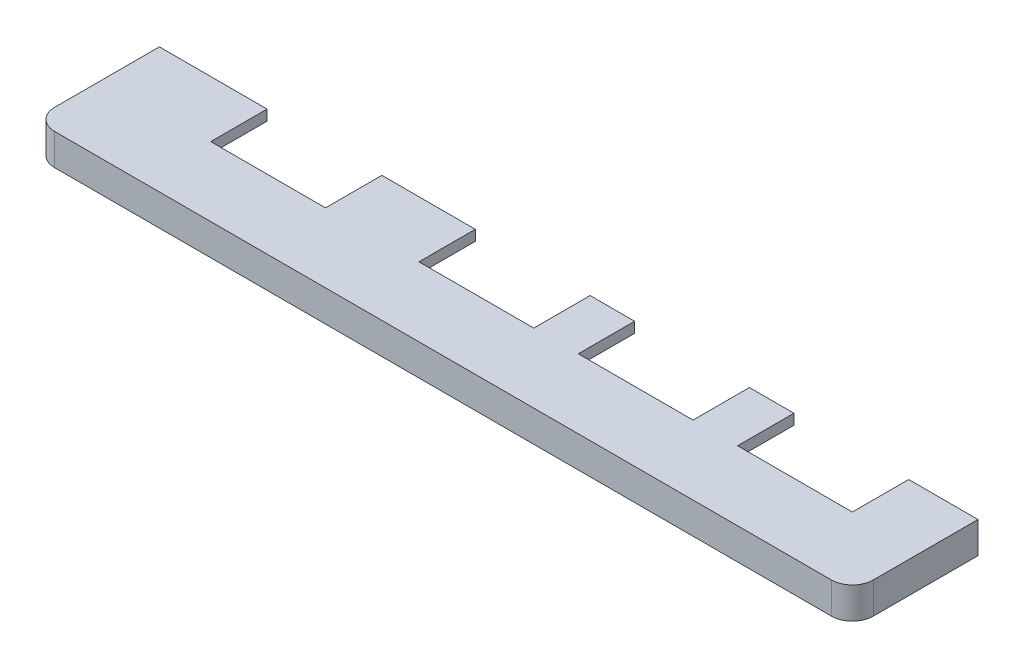
ISO-10303-21;
HEADER;
FILE_DESCRIPTION(('STEP AP214'),'2;1');
FILE_NAME('part.step','',(''),(''),'','','');
FILE_SCHEMA(('AUTOMOTIVE_DESIGN { 1 0 10303 214 1 1 1 1 }'));
ENDSEC;
DATA;
#1=APPLICATION_CONTEXT('core data for automotive mechanical design processes');
#2=APPLICATION_PROTOCOL_DEFINITION('international standard','automotive_design',2000,#1);
#3=PRODUCT_CONTEXT('',#1,'mechanical');
#4=PRODUCT('Part','Part','',(#3));
#5=PRODUCT_RELATED_PRODUCT_CATEGORY('part','',(#4));
#6=PRODUCT_DEFINITION_FORMATION('','',#4);
#7=PRODUCT_DEFINITION_CONTEXT('part definition',#1,'design');
#8=PRODUCT_DEFINITION('design','',#6,#7);
#9=PRODUCT_DEFINITION_SHAPE('','',#8);
#10=(LENGTH_UNIT() NAMED_UNIT(*) SI_UNIT(.MILLI.,.METRE.));
#11=(NAMED_UNIT(*) PLANE_ANGLE_UNIT() SI_UNIT($,.RADIAN.));
#12=(NAMED_UNIT(*) SI_UNIT($,.STERADIAN.) SOLID_ANGLE_UNIT());
#13=UNCERTAINTY_MEASURE_WITH_UNIT(LENGTH_MEASURE(1.E-05),#10,'distance_accuracy_value','');
#14=(GEOMETRIC_REPRESENTATION_CONTEXT(3) GLOBAL_UNCERTAINTY_ASSIGNED_CONTEXT((#13)) GLOBAL_UNIT_ASSIGNED_CONTEXT((#10,
#11,#12)) REPRESENTATION_CONTEXT('',''));
#15=CARTESIAN_POINT('',(0.,0.,0.));
#16=DIRECTION('',(0.,0.,1.));
#17=DIRECTION('',(1.,0.,0.));
#18=AXIS2_PLACEMENT_3D('',#15,#16,#17);
#19=CARTESIAN_POINT('',(0.,1.27,29.6799));
#20=DIRECTION('',(0.,0.,-1.));
#21=DIRECTION('',(-1.,0.,0.));
#22=AXIS2_PLACEMENT_3D('',#19,#20,#21);
#23=PLANE('',#22);
#24=DIRECTION('',(1.,0.,0.));
#25=VECTOR('',#24,1.);
#26=CARTESIAN_POINT('',(0.,0.,29.6799));
#27=LINE('',#26,#25);
#28=CARTESIAN_POINT('',(-36.6395,0.,29.6799));
#29=VERTEX_POINT('',#28);
#30=CARTESIAN_POINT('',(-22.6949,0.,29.6799));
#31=VERTEX_POINT('',#30);
#32=EDGE_CURVE('E343',#29,#31,#27,.T.);
#33=ORIENTED_EDGE('',*,*,#32,.F.);
#34=DIRECTION('',(0.,-1.,0.));
#35=VECTOR('',#34,1.);
#36=CARTESIAN_POINT('',(-36.6395,1.27,29.6799));
#37=LINE('',#36,#35);
#38=CARTESIAN_POINT('',(-36.6395,1.27,29.6799));
#39=VERTEX_POINT('',#38);
#40=EDGE_CURVE('E373',#39,#29,#37,.T.);
#41=ORIENTED_EDGE('',*,*,#40,.F.);
#42=DIRECTION('',(1.,0.,0.));
#43=VECTOR('',#42,1.);
#44=CARTESIAN_POINT('',(0.,1.27,29.6799));
#45=LINE('',#44,#43);
#46=CARTESIAN_POINT('',(-22.6949,1.27,29.6799));
#47=VERTEX_POINT('',#46);
#48=EDGE_CURVE('E398',#39,#47,#45,.T.);
#49=ORIENTED_EDGE('',*,*,#48,.T.);
#50=DIRECTION('',(0.,-1.,0.));
#51=VECTOR('',#50,1.);
#52=CARTESIAN_POINT('',(-22.6949,1.27,29.6799));
#53=LINE('',#52,#51);
#54=EDGE_CURVE('E401',#47,#31,#53,.T.);
#55=ORIENTED_EDGE('',*,*,#54,.T.);
#56=EDGE_LOOP('',(#33,#41,#49,#55));
#57=FACE_BOUND('',#56,.T.);
#58=ADVANCED_FACE('F34',(#57),#23,.T.);
#59=CARTESIAN_POINT('',(0.,1.27,29.6799));
#60=DIRECTION('',(0.,0.,-1.));
#61=DIRECTION('',(-1.,0.,0.));
#62=AXIS2_PLACEMENT_3D('',#59,#60,#61);
#63=PLANE('',#62);
#64=DIRECTION('',(1.,0.,0.));
#65=VECTOR('',#64,1.);
#66=CARTESIAN_POINT('',(0.,0.,29.6799));
#67=LINE('',#66,#65);
#68=CARTESIAN_POINT('',(-11.3411,0.,29.6799));
#69=VERTEX_POINT('',#68);
#70=CARTESIAN_POINT('',(2.60350000000002,0.,29.6799));
#71=VERTEX_POINT('',#70);
#72=EDGE_CURVE('E347',#69,#71,#67,.T.);
#73=ORIENTED_EDGE('',*,*,#72,.F.);
#74=DIRECTION('',(0.,-1.,0.));
#75=VECTOR('',#74,1.);
#76=CARTESIAN_POINT('',(-11.3411,1.27,29.6799));
#77=LINE('',#76,#75);
#78=CARTESIAN_POINT('',(-11.3411,1.27,29.6799));
#79=VERTEX_POINT('',#78);
#80=EDGE_CURVE('E383',#79,#69,#77,.T.);
#81=ORIENTED_EDGE('',*,*,#80,.F.);
#82=DIRECTION('',(1.,0.,0.));
#83=VECTOR('',#82,1.);
#84=CARTESIAN_POINT('',(0.,1.27,29.6799));
#85=LINE('',#84,#83);
#86=CARTESIAN_POINT('',(2.60350000000002,1.27,29.6799));
#87=VERTEX_POINT('',#86);
#88=EDGE_CURVE('E384',#79,#87,#85,.T.);
#89=ORIENTED_EDGE('',*,*,#88,.T.);
#90=DIRECTION('',(0.,-1.,0.));
#91=VECTOR('',#90,1.);
#92=CARTESIAN_POINT('',(2.60350000000002,1.27,29.6799));
#93=LINE('',#92,#91);
#94=EDGE_CURVE('E387',#87,#71,#93,.T.);
#95=ORIENTED_EDGE('',*,*,#94,.T.);
#96=EDGE_LOOP('',(#73,#81,#89,#95));
#97=FACE_BOUND('',#96,.T.);
#98=ADVANCED_FACE('F477',(#97),#63,.T.);
#99=CARTESIAN_POINT('',(0.,1.27,29.6799));
#100=DIRECTION('',(0.,0.,-1.));
#101=DIRECTION('',(-1.,0.,0.));
#102=AXIS2_PLACEMENT_3D('',#99,#100,#101);
#103=PLANE('',#102);
#104=DIRECTION('',(1.,0.,0.));
#105=VECTOR('',#104,1.);
#106=CARTESIAN_POINT('',(0.,0.,29.6799));
#107=LINE('',#106,#105);
#108=CARTESIAN_POINT('',(8.01370000000001,0.,29.6799));
#109=VERTEX_POINT('',#108);
#110=CARTESIAN_POINT('',(21.9583,0.,29.6799));
#111=VERTEX_POINT('',#110);
#112=EDGE_CURVE('E459',#109,#111,#107,.T.);
#113=ORIENTED_EDGE('',*,*,#112,.F.);
#114=DIRECTION('',(0.,-1.,0.));
#115=VECTOR('',#114,1.);
#116=CARTESIAN_POINT('',(8.01370000000001,1.27,29.6799));
#117=LINE('',#116,#115);
#118=CARTESIAN_POINT('',(8.01370000000001,1.27,29.6799));
#119=VERTEX_POINT('',#118);
#120=EDGE_CURVE('E372',#119,#109,#117,.T.);
#121=ORIENTED_EDGE('',*,*,#120,.F.);
#122=DIRECTION('',(1.,0.,0.));
#123=VECTOR('',#122,1.);
#124=CARTESIAN_POINT('',(0.,1.27,29.6799));
#125=LINE('',#124,#123);
#126=CARTESIAN_POINT('',(21.9583,1.27,29.6799));
#127=VERTEX_POINT('',#126);
#128=EDGE_CURVE('E374',#119,#127,#125,.T.);
#129=ORIENTED_EDGE('',*,*,#128,.T.);
#130=DIRECTION('',(0.,-1.,0.));
#131=VECTOR('',#130,1.);
#132=CARTESIAN_POINT('',(21.9583,1.27,29.6799));
#133=LINE('',#132,#131);
#134=EDGE_CURVE('E377',#127,#111,#133,.T.);
#135=ORIENTED_EDGE('',*,*,#134,.T.);
#136=EDGE_LOOP('',(#113,#121,#129,#135));
#137=FACE_BOUND('',#136,.T.);
#138=ADVANCED_FACE('F595',(#137),#103,.T.);
#139=CARTESIAN_POINT('',(0.,1.27,29.6799));
#140=DIRECTION('',(0.,0.,-1.));
#141=DIRECTION('',(-1.,0.,0.));
#142=AXIS2_PLACEMENT_3D('',#139,#140,#141);
#143=PLANE('',#142);
#144=DIRECTION('',(1.,0.,0.));
#145=VECTOR('',#144,1.);
#146=CARTESIAN_POINT('',(0.,0.,29.6799));
#147=LINE('',#146,#145);
#148=CARTESIAN_POINT('',(27.3685000000001,0.,29.6799));
#149=VERTEX_POINT('',#148);
#150=CARTESIAN_POINT('',(41.3131000000001,0.,29.6799));
#151=VERTEX_POINT('',#150);
#152=EDGE_CURVE('E308',#149,#151,#147,.T.);
#153=ORIENTED_EDGE('',*,*,#152,.F.);
#154=DIRECTION('',(0.,-1.,0.));
#155=VECTOR('',#154,1.);
#156=CARTESIAN_POINT('',(27.3685000000001,1.27,29.6799));
#157=LINE('',#156,#155);
#158=CARTESIAN_POINT('',(27.3685000000001,1.27,29.6799));
#159=VERTEX_POINT('',#158);
#160=EDGE_CURVE('E362',#159,#149,#157,.T.);
#161=ORIENTED_EDGE('',*,*,#160,.F.);
#162=DIRECTION('',(1.,0.,0.));
#163=VECTOR('',#162,1.);
#164=CARTESIAN_POINT('',(0.,1.27,29.6799));
#165=LINE('',#164,#163);
#166=CARTESIAN_POINT('',(41.3131000000001,1.27,29.6799));
#167=VERTEX_POINT('',#166);
#168=EDGE_CURVE('E364',#159,#167,#165,.T.);
#169=ORIENTED_EDGE('',*,*,#168,.T.);
#170=DIRECTION('',(0.,-1.,0.));
#171=VECTOR('',#170,1.);
#172=CARTESIAN_POINT('',(41.3131000000001,1.27,29.6799));
#173=LINE('',#172,#171);
#174=EDGE_CURVE('E367',#167,#151,#173,.T.);
#175=ORIENTED_EDGE('',*,*,#174,.T.);
#176=EDGE_LOOP('',(#153,#161,#169,#175));
#177=FACE_BOUND('',#176,.T.);
#178=ADVANCED_FACE('F582',(#177),#143,.T.);
#179=CARTESIAN_POINT('',(0.,-2.54,36.83));
#180=DIRECTION('',(0.,0.,1.));
#181=DIRECTION('',(1.,0.,0.));
#182=AXIS2_PLACEMENT_3D('',#179,#180,#181);
#183=PLANE('',#182);
#184=DIRECTION('',(1.,0.,0.));
#185=VECTOR('',#184,1.);
#186=CARTESIAN_POINT('',(0.,0.,36.83));
#187=LINE('',#186,#185);
#188=CARTESIAN_POINT('',(-48.4632,0.,36.83));
#189=VERTEX_POINT('',#188);
#190=CARTESIAN_POINT('',(48.4632,0.,36.83));
#191=VERTEX_POINT('',#190);
#192=EDGE_CURVE('E287',#189,#191,#187,.T.);
#193=ORIENTED_EDGE('',*,*,#192,.T.);
#194=DIRECTION('',(0.,1.,0.));
#195=VECTOR('',#194,1.);
#196=CARTESIAN_POINT('',(48.4632,-2.54,36.83));
#197=LINE('',#196,#195);
#198=CARTESIAN_POINT('',(48.4632,-2.54,36.83));
#199=VERTEX_POINT('',#198);
#200=EDGE_CURVE('E301',#199,#191,#197,.T.);
#201=ORIENTED_EDGE('',*,*,#200,.F.);
#202=DIRECTION('',(1.,0.,0.));
#203=VECTOR('',#202,1.);
#204=CARTESIAN_POINT('',(0.,-2.54,36.83));
#205=LINE('',#204,#203);
#206=CARTESIAN_POINT('',(-48.4632,-2.54,36.83));
#207=VERTEX_POINT('',#206);
#208=EDGE_CURVE('E296',#207,#199,#205,.T.);
#209=ORIENTED_EDGE('',*,*,#208,.F.);
#210=DIRECTION('',(0.,1.,0.));
#211=VECTOR('',#210,1.);
#212=CARTESIAN_POINT('',(-48.4632,-2.54,36.83));
#213=LINE('',#212,#211);
#214=EDGE_CURVE('E282',#207,#189,#213,.T.);
#215=ORIENTED_EDGE('',*,*,#214,.T.);
#216=EDGE_LOOP('',(#193,#201,#209,#215));
#217=FACE_BOUND('',#216,.T.);
#218=ADVANCED_FACE('F626',(#217),#183,.F.);
#219=CARTESIAN_POINT('',(-47.1932,1.27,35.56));
#220=DIRECTION('',(0.,1.,0.));
#221=DIRECTION('',(0.,0.,1.));
#222=AXIS2_PLACEMENT_3D('',#219,#220,#221);
#223=CYLINDRICAL_SURFACE('',#222,2.54);
#224=CARTESIAN_POINT('',(-47.1932,1.27,35.56));
#225=DIRECTION('',(0.,1.,0.));
#226=DIRECTION('',(0.,0.,1.));
#227=AXIS2_PLACEMENT_3D('',#224,#225,#226);
#228=CIRCLE('',#227,2.54);
#229=CARTESIAN_POINT('',(-49.7332,1.27,35.56));
#230=VERTEX_POINT('',#229);
#231=CARTESIAN_POINT('',(-47.1932,1.27,38.1));
#232=VERTEX_POINT('',#231);
#233=EDGE_CURVE('E395',#230,#232,#228,.T.);
#234=ORIENTED_EDGE('',*,*,#233,.F.);
#235=DIRECTION('',(0.,-1.,0.));
#236=VECTOR('',#235,1.);
#237=CARTESIAN_POINT('',(-49.7332,1.27,35.56));
#238=LINE('',#237,#236);
#239=CARTESIAN_POINT('',(-49.7332,-2.54,35.56));
#240=VERTEX_POINT('',#239);
#241=EDGE_CURVE('E427',#240,#230,#238,.F.);
#242=ORIENTED_EDGE('',*,*,#241,.F.);
#243=CARTESIAN_POINT('',(-47.1932,-2.54,35.56));
#244=DIRECTION('',(0.,-1.,0.));
#245=DIRECTION('',(0.,0.,-1.));
#246=AXIS2_PLACEMENT_3D('',#243,#244,#245);
#247=CIRCLE('',#246,2.54);
#248=CARTESIAN_POINT('',(-47.1932,-2.54,38.1));
#249=VERTEX_POINT('',#248);
#250=EDGE_CURVE('E297',#249,#240,#247,.T.);
#251=ORIENTED_EDGE('',*,*,#250,.F.);
#252=DIRECTION('',(0.,-1.,0.));
#253=VECTOR('',#252,1.);
#254=CARTESIAN_POINT('',(-47.1932,0.,38.1));
#255=LINE('',#254,#253);
#256=EDGE_CURVE('E442',#232,#249,#255,.T.);
#257=ORIENTED_EDGE('',*,*,#256,.F.);
#258=EDGE_LOOP('',(#234,#242,#251,#257));
#259=FACE_BOUND('',#258,.T.);
#260=ADVANCED_FACE('F566',(#259),#223,.T.);
#261=CARTESIAN_POINT('',(0.,1.27,38.1));
#262=DIRECTION('',(0.,0.,-1.));
#263=DIRECTION('',(-1.,0.,0.));
#264=AXIS2_PLACEMENT_3D('',#261,#262,#263);
#265=PLANE('',#264);
#266=ORIENTED_EDGE('',*,*,#256,.T.);
#267=DIRECTION('',(-1.,0.,0.));
#268=VECTOR('',#267,1.);
#269=CARTESIAN_POINT('',(0.,-2.54,38.1));
#270=LINE('',#269,#268);
#271=CARTESIAN_POINT('',(47.1932000000001,-2.54,38.1));
#272=VERTEX_POINT('',#271);
#273=EDGE_CURVE('E284',#272,#249,#270,.T.);
#274=ORIENTED_EDGE('',*,*,#273,.F.);
#275=DIRECTION('',(0.,-1.,0.));
#276=VECTOR('',#275,1.);
#277=CARTESIAN_POINT('',(47.1932000000001,1.27,38.1));
#278=LINE('',#277,#276);
#279=CARTESIAN_POINT('',(47.1932000000001,1.27,38.1));
#280=VERTEX_POINT('',#279);
#281=EDGE_CURVE('E440',#272,#280,#278,.F.);
#282=ORIENTED_EDGE('',*,*,#281,.T.);
#283=DIRECTION('',(1.,0.,0.));
#284=VECTOR('',#283,1.);
#285=CARTESIAN_POINT('',(0.,1.27,38.1));
#286=LINE('',#285,#284);
#287=EDGE_CURVE('E391',#232,#280,#286,.T.);
#288=ORIENTED_EDGE('',*,*,#287,.F.);
#289=EDGE_LOOP('',(#266,#274,#282,#288));
#290=FACE_BOUND('',#289,.T.);
#291=ADVANCED_FACE('F570',(#290),#265,.F.);
#292=CARTESIAN_POINT('',(47.1932000000001,1.27,35.56));
#293=DIRECTION('',(0.,-1.,0.));
#294=DIRECTION('',(0.,0.,-1.));
#295=AXIS2_PLACEMENT_3D('',#292,#293,#294);
#296=CYLINDRICAL_SURFACE('',#295,2.54);
#297=CARTESIAN_POINT('',(47.1932000000001,1.27,35.56));
#298=DIRECTION('',(0.,1.,0.));
#299=DIRECTION('',(0.,0.,1.));
#300=AXIS2_PLACEMENT_3D('',#297,#298,#299);
#301=CIRCLE('',#300,2.54);
#302=CARTESIAN_POINT('',(49.7332000000001,1.27,35.56));
#303=VERTEX_POINT('',#302);
#304=EDGE_CURVE('E394',#280,#303,#301,.T.);
#305=ORIENTED_EDGE('',*,*,#304,.F.);
#306=ORIENTED_EDGE('',*,*,#281,.F.);
#307=CARTESIAN_POINT('',(47.1932000000001,-2.54,35.56));
#308=DIRECTION('',(0.,-1.,0.));
#309=DIRECTION('',(0.,0.,-1.));
#310=AXIS2_PLACEMENT_3D('',#307,#308,#309);
#311=CIRCLE('',#310,2.54);
#312=CARTESIAN_POINT('',(49.7332000000001,-2.54,35.56));
#313=VERTEX_POINT('',#312);
#314=EDGE_CURVE('E281',#313,#272,#311,.T.);
#315=ORIENTED_EDGE('',*,*,#314,.F.);
#316=DIRECTION('',(0.,-1.,0.));
#317=VECTOR('',#316,1.);
#318=CARTESIAN_POINT('',(49.7332000000001,1.27,35.56));
#319=LINE('',#318,#317);
#320=EDGE_CURVE('E279',#303,#313,#319,.T.);
#321=ORIENTED_EDGE('',*,*,#320,.F.);
#322=EDGE_LOOP('',(#305,#306,#315,#321));
#323=FACE_BOUND('',#322,.T.);
#324=ADVANCED_FACE('F572',(#323),#296,.T.);
#325=CARTESIAN_POINT('',(0.,-2.54,32.385));
#326=DIRECTION('',(0.,0.,1.));
#327=DIRECTION('',(1.,0.,0.));
#328=AXIS2_PLACEMENT_3D('',#325,#326,#327);
#329=PLANE('',#328);
#330=DIRECTION('',(1.,0.,0.));
#331=VECTOR('',#330,1.);
#332=CARTESIAN_POINT('',(0.,0.,32.385));
#333=LINE('',#332,#331);
#334=CARTESIAN_POINT('',(-44.0182,0.,32.385));
#335=VERTEX_POINT('',#334);
#336=CARTESIAN_POINT('',(44.0182,0.,32.385));
#337=VERTEX_POINT('',#336);
#338=EDGE_CURVE('E327',#335,#337,#333,.T.);
#339=ORIENTED_EDGE('',*,*,#338,.T.);
#340=DIRECTION('',(0.,1.,0.));
#341=VECTOR('',#340,1.);
#342=CARTESIAN_POINT('',(44.0182,-2.54,32.385));
#343=LINE('',#342,#341);
#344=CARTESIAN_POINT('',(44.0182,-2.54,32.385));
#345=VERTEX_POINT('',#344);
#346=EDGE_CURVE('E317',#345,#337,#343,.T.);
#347=ORIENTED_EDGE('',*,*,#346,.F.);
#348=DIRECTION('',(1.,0.,0.));
#349=VECTOR('',#348,1.);
#350=CARTESIAN_POINT('',(0.,-2.54,32.385));
#351=LINE('',#350,#349);
#352=CARTESIAN_POINT('',(-44.0182,-2.54,32.385));
#353=VERTEX_POINT('',#352);
#354=EDGE_CURVE('E320',#353,#345,#351,.T.);
#355=ORIENTED_EDGE('',*,*,#354,.F.);
#356=DIRECTION('',(0.,1.,0.));
#357=VECTOR('',#356,1.);
#358=CARTESIAN_POINT('',(-44.0182,-2.54,32.385));
#359=LINE('',#358,#357);
#360=EDGE_CURVE('E339',#353,#335,#359,.T.);
#361=ORIENTED_EDGE('',*,*,#360,.T.);
#362=EDGE_LOOP('',(#339,#347,#355,#361));
#363=FACE_BOUND('',#362,.T.);
#364=ADVANCED_FACE('F636',(#363),#329,.F.);
#365=CARTESIAN_POINT('',(0.,-2.54,33.655));
#366=DIRECTION('',(0.,0.,1.));
#367=DIRECTION('',(1.,0.,0.));
#368=AXIS2_PLACEMENT_3D('',#365,#366,#367);
#369=PLANE('',#368);
#370=DIRECTION('',(1.,0.,0.));
#371=VECTOR('',#370,1.);
#372=CARTESIAN_POINT('',(0.,0.,33.655));
#373=LINE('',#372,#371);
#374=CARTESIAN_POINT('',(-45.2882,0.,33.655));
#375=VERTEX_POINT('',#374);
#376=CARTESIAN_POINT('',(45.2882,0.,33.655));
#377=VERTEX_POINT('',#376);
#378=EDGE_CURVE('E307',#375,#377,#373,.T.);
#379=ORIENTED_EDGE('',*,*,#378,.F.);
#380=DIRECTION('',(0.,1.,0.));
#381=VECTOR('',#380,1.);
#382=CARTESIAN_POINT('',(-45.2882,-2.54,33.655));
#383=LINE('',#382,#381);
#384=CARTESIAN_POINT('',(-45.2882,-2.54,33.655));
#385=VERTEX_POINT('',#384);
#386=EDGE_CURVE('E328',#385,#375,#383,.T.);
#387=ORIENTED_EDGE('',*,*,#386,.F.);
#388=DIRECTION('',(1.,0.,0.));
#389=VECTOR('',#388,1.);
#390=CARTESIAN_POINT('',(0.,-2.54,33.655));
#391=LINE('',#390,#389);
#392=CARTESIAN_POINT('',(45.2882,-2.54,33.655));
#393=VERTEX_POINT('',#392);
#394=EDGE_CURVE('E303',#385,#393,#391,.T.);
#395=ORIENTED_EDGE('',*,*,#394,.T.);
#396=DIRECTION('',(0.,1.,0.));
#397=VECTOR('',#396,1.);
#398=CARTESIAN_POINT('',(45.2882,-2.54,33.655));
#399=LINE('',#398,#397);
#400=EDGE_CURVE('E336',#393,#377,#399,.T.);
#401=ORIENTED_EDGE('',*,*,#400,.T.);
#402=EDGE_LOOP('',(#379,#387,#395,#401));
#403=FACE_BOUND('',#402,.T.);
#404=ADVANCED_FACE('F639',(#403),#369,.T.);
#405=CARTESIAN_POINT('',(0.,-2.54,0.));
#406=DIRECTION('',(0.,-1.,0.));
#407=DIRECTION('',(0.,0.,-1.));
#408=AXIS2_PLACEMENT_3D('',#405,#406,#407);
#409=PLANE('',#408);
#410=DIRECTION('',(-1.,0.,0.));
#411=VECTOR('',#410,1.);
#412=CARTESIAN_POINT('',(0.,-2.54,22.8346));
#413=LINE('',#412,#411);
#414=CARTESIAN_POINT('',(45.2882,-2.54,22.8346));
#415=VERTEX_POINT('',#414);
#416=CARTESIAN_POINT('',(44.0182,-2.54,22.8346));
#417=VERTEX_POINT('',#416);
#418=EDGE_CURVE('E11',#415,#417,#413,.T.);
#419=ORIENTED_EDGE('',*,*,#418,.F.);
#420=DIRECTION('',(0.,0.,-1.));
#421=VECTOR('',#420,1.);
#422=CARTESIAN_POINT('',(45.2882,-2.54,0.));
#423=LINE('',#422,#421);
#424=EDGE_CURVE('E313',#393,#415,#423,.T.);
#425=ORIENTED_EDGE('',*,*,#424,.F.);
#426=ORIENTED_EDGE('',*,*,#394,.F.);
#427=DIRECTION('',(0.,0.,-1.));
#428=VECTOR('',#427,1.);
#429=CARTESIAN_POINT('',(-45.2882,-2.54,0.));
#430=LINE('',#429,#428);
#431=CARTESIAN_POINT('',(-45.2882,-2.54,22.8346));
#432=VERTEX_POINT('',#431);
#433=EDGE_CURVE('E316',#385,#432,#430,.T.);
#434=ORIENTED_EDGE('',*,*,#433,.T.);
#435=CARTESIAN_POINT('',(-44.0182,-2.54,22.8346));
#436=VERTEX_POINT('',#435);
#437=EDGE_CURVE('E38',#436,#432,#413,.T.);
#438=ORIENTED_EDGE('',*,*,#437,.F.);
#439=DIRECTION('',(0.,0.,-1.));
#440=VECTOR('',#439,1.);
#441=CARTESIAN_POINT('',(-44.0182,-2.54,0.));
#442=LINE('',#441,#440);
#443=EDGE_CURVE('E324',#353,#436,#442,.T.);
#444=ORIENTED_EDGE('',*,*,#443,.F.);
#445=ORIENTED_EDGE('',*,*,#354,.T.);
#446=DIRECTION('',(0.,0.,-1.));
#447=VECTOR('',#446,1.);
#448=CARTESIAN_POINT('',(44.0182,-2.54,0.));
#449=LINE('',#448,#447);
#450=EDGE_CURVE('E321',#345,#417,#449,.T.);
#451=ORIENTED_EDGE('',*,*,#450,.T.);
#452=EDGE_LOOP('',(#419,#425,#426,#434,#438,#444,#445,#451));
#453=FACE_BOUND('',#452,.T.);
#454=ADVANCED_FACE('F643',(#453),#409,.T.);
#455=CARTESIAN_POINT('',(45.2882,-2.54,0.));
#456=DIRECTION('',(1.,0.,0.));
#457=DIRECTION('',(0.,0.,-1.));
#458=AXIS2_PLACEMENT_3D('',#455,#456,#457);
#459=PLANE('',#458);
#460=DIRECTION('',(0.,-1.,0.));
#461=VECTOR('',#460,1.);
#462=CARTESIAN_POINT('',(45.2882,-2.54,22.8346));
#463=LINE('',#462,#461);
#464=CARTESIAN_POINT('',(45.2882,0.,22.8346));
#465=VERTEX_POINT('',#464);
#466=EDGE_CURVE('E500',#465,#415,#463,.T.);
#467=ORIENTED_EDGE('',*,*,#466,.F.);
#468=DIRECTION('',(0.,0.,-1.));
#469=VECTOR('',#468,1.);
#470=CARTESIAN_POINT('',(45.2882,0.,0.));
#471=LINE('',#470,#469);
#472=EDGE_CURVE('E329',#377,#465,#471,.T.);
#473=ORIENTED_EDGE('',*,*,#472,.F.);
#474=ORIENTED_EDGE('',*,*,#400,.F.);
#475=ORIENTED_EDGE('',*,*,#424,.T.);
#476=EDGE_LOOP('',(#467,#473,#474,#475));
#477=FACE_BOUND('',#476,.T.);
#478=ADVANCED_FACE('F647',(#477),#459,.T.);
#479=CARTESIAN_POINT('',(44.0182,-2.54,0.));
#480=DIRECTION('',(1.,0.,0.));
#481=DIRECTION('',(0.,0.,-1.));
#482=AXIS2_PLACEMENT_3D('',#479,#480,#481);
#483=PLANE('',#482);
#484=DIRECTION('',(0.,0.,-1.));
#485=VECTOR('',#484,1.);
#486=CARTESIAN_POINT('',(44.0182,0.,0.));
#487=LINE('',#486,#485);
#488=CARTESIAN_POINT('',(44.0182,0.,22.8346));
#489=VERTEX_POINT('',#488);
#490=EDGE_CURVE('E337',#337,#489,#487,.T.);
#491=ORIENTED_EDGE('',*,*,#490,.T.);
#492=DIRECTION('',(0.,-1.,0.));
#493=VECTOR('',#492,1.);
#494=CARTESIAN_POINT('',(44.0182,-2.54,22.8346));
#495=LINE('',#494,#493);
#496=EDGE_CURVE('E509',#489,#417,#495,.T.);
#497=ORIENTED_EDGE('',*,*,#496,.T.);
#498=ORIENTED_EDGE('',*,*,#450,.F.);
#499=ORIENTED_EDGE('',*,*,#346,.T.);
#500=EDGE_LOOP('',(#491,#497,#498,#499));
#501=FACE_BOUND('',#500,.T.);
#502=ADVANCED_FACE('F651',(#501),#483,.F.);
#503=CARTESIAN_POINT('',(-44.0182,-2.54,0.));
#504=DIRECTION('',(1.,0.,0.));
#505=DIRECTION('',(0.,0.,-1.));
#506=AXIS2_PLACEMENT_3D('',#503,#504,#505);
#507=PLANE('',#506);
#508=DIRECTION('',(0.,-1.,0.));
#509=VECTOR('',#508,1.);
#510=CARTESIAN_POINT('',(-44.0182,-2.54,22.8346));
#511=LINE('',#510,#509);
#512=CARTESIAN_POINT('',(-44.0182,0.,22.8346));
#513=VERTEX_POINT('',#512);
#514=EDGE_CURVE('E520',#513,#436,#511,.T.);
#515=ORIENTED_EDGE('',*,*,#514,.F.);
#516=DIRECTION('',(0.,0.,-1.));
#517=VECTOR('',#516,1.);
#518=CARTESIAN_POINT('',(-44.0182,0.,0.));
#519=LINE('',#518,#517);
#520=EDGE_CURVE('E340',#335,#513,#519,.T.);
#521=ORIENTED_EDGE('',*,*,#520,.F.);
#522=ORIENTED_EDGE('',*,*,#360,.F.);
#523=ORIENTED_EDGE('',*,*,#443,.T.);
#524=EDGE_LOOP('',(#515,#521,#522,#523));
#525=FACE_BOUND('',#524,.T.);
#526=ADVANCED_FACE('F655',(#525),#507,.T.);
#527=CARTESIAN_POINT('',(-45.2882,-2.54,0.));
#528=DIRECTION('',(1.,0.,0.));
#529=DIRECTION('',(0.,0.,-1.));
#530=AXIS2_PLACEMENT_3D('',#527,#528,#529);
#531=PLANE('',#530);
#532=DIRECTION('',(0.,0.,-1.));
#533=VECTOR('',#532,1.);
#534=CARTESIAN_POINT('',(-45.2882,0.,0.));
#535=LINE('',#534,#533);
#536=CARTESIAN_POINT('',(-45.2882,0.,22.8346));
#537=VERTEX_POINT('',#536);
#538=EDGE_CURVE('E333',#375,#537,#535,.T.);
#539=ORIENTED_EDGE('',*,*,#538,.T.);
#540=DIRECTION('',(0.,-1.,0.));
#541=VECTOR('',#540,1.);
#542=CARTESIAN_POINT('',(-45.2882,-2.54,22.8346));
#543=LINE('',#542,#541);
#544=EDGE_CURVE('E525',#537,#432,#543,.T.);
#545=ORIENTED_EDGE('',*,*,#544,.T.);
#546=ORIENTED_EDGE('',*,*,#433,.F.);
#547=ORIENTED_EDGE('',*,*,#386,.T.);
#548=EDGE_LOOP('',(#539,#545,#546,#547));
#549=FACE_BOUND('',#548,.T.);
#550=ADVANCED_FACE('F659',(#549),#531,.F.);
#551=CARTESIAN_POINT('',(0.,1.27,0.));
#552=DIRECTION('',(0.,1.,0.));
#553=DIRECTION('',(0.,0.,1.));
#554=AXIS2_PLACEMENT_3D('',#551,#552,#553);
#555=PLANE('',#554);
#556=DIRECTION('',(1.,0.,0.));
#557=VECTOR('',#556,1.);
#558=CARTESIAN_POINT('',(-49.7332,1.27,22.8346));
#559=LINE('',#558,#557);
#560=CARTESIAN_POINT('',(-49.7332,1.27,22.8346));
#561=VERTEX_POINT('',#560);
#562=CARTESIAN_POINT('',(-36.6395,1.27,22.8346));
#563=VERTEX_POINT('',#562);
#564=EDGE_CURVE('E275',#561,#563,#559,.T.);
#565=ORIENTED_EDGE('',*,*,#564,.F.);
#566=DIRECTION('',(0.,0.,-1.));
#567=VECTOR('',#566,1.);
#568=CARTESIAN_POINT('',(-49.7332,1.27,0.));
#569=LINE('',#568,#567);
#570=EDGE_CURVE('E363',#230,#561,#569,.T.);
#571=ORIENTED_EDGE('',*,*,#570,.F.);
#572=ORIENTED_EDGE('',*,*,#233,.T.);
#573=ORIENTED_EDGE('',*,*,#287,.T.);
#574=ORIENTED_EDGE('',*,*,#304,.T.);
#575=DIRECTION('',(0.,0.,-1.));
#576=VECTOR('',#575,1.);
#577=CARTESIAN_POINT('',(49.7332000000001,1.27,0.));
#578=LINE('',#577,#576);
#579=CARTESIAN_POINT('',(49.7332000000001,1.27,22.8346));
#580=VERTEX_POINT('',#579);
#581=EDGE_CURVE('E291',#303,#580,#578,.T.);
#582=ORIENTED_EDGE('',*,*,#581,.T.);
#583=CARTESIAN_POINT('',(41.3131000000001,1.27,22.8346));
#584=VERTEX_POINT('',#583);
#585=EDGE_CURVE('E259',#584,#580,#559,.T.);
#586=ORIENTED_EDGE('',*,*,#585,.F.);
#587=DIRECTION('',(0.,0.,1.));
#588=VECTOR('',#587,1.);
#589=CARTESIAN_POINT('',(41.3131000000001,1.27,0.));
#590=LINE('',#589,#588);
#591=EDGE_CURVE('E312',#584,#167,#590,.T.);
#592=ORIENTED_EDGE('',*,*,#591,.T.);
#593=ORIENTED_EDGE('',*,*,#168,.F.);
#594=DIRECTION('',(0.,0.,1.));
#595=VECTOR('',#594,1.);
#596=CARTESIAN_POINT('',(27.3685,1.27,0.));
#597=LINE('',#596,#595);
#598=CARTESIAN_POINT('',(27.3685000000001,1.27,22.8346));
#599=VERTEX_POINT('',#598);
#600=EDGE_CURVE('E360',#599,#159,#597,.T.);
#601=ORIENTED_EDGE('',*,*,#600,.F.);
#602=CARTESIAN_POINT('',(21.9583,1.27,22.8346));
#603=VERTEX_POINT('',#602);
#604=EDGE_CURVE('E497',#603,#599,#559,.T.);
#605=ORIENTED_EDGE('',*,*,#604,.F.);
#606=DIRECTION('',(0.,0.,1.));
#607=VECTOR('',#606,1.);
#608=CARTESIAN_POINT('',(21.9583,1.27,0.));
#609=LINE('',#608,#607);
#610=EDGE_CURVE('E369',#603,#127,#609,.T.);
#611=ORIENTED_EDGE('',*,*,#610,.T.);
#612=ORIENTED_EDGE('',*,*,#128,.F.);
#613=DIRECTION('',(0.,0.,1.));
#614=VECTOR('',#613,1.);
#615=CARTESIAN_POINT('',(8.01370000000001,1.27,0.));
#616=LINE('',#615,#614);
#617=CARTESIAN_POINT('',(8.01370000000001,1.27,22.8346));
#618=VERTEX_POINT('',#617);
#619=EDGE_CURVE('E370',#618,#119,#616,.T.);
#620=ORIENTED_EDGE('',*,*,#619,.F.);
#621=CARTESIAN_POINT('',(2.60350000000002,1.27,22.8346));
#622=VERTEX_POINT('',#621);
#623=EDGE_CURVE('E493',#622,#618,#559,.T.);
#624=ORIENTED_EDGE('',*,*,#623,.F.);
#625=DIRECTION('',(0.,0.,1.));
#626=VECTOR('',#625,1.);
#627=CARTESIAN_POINT('',(2.60350000000002,1.27,0.));
#628=LINE('',#627,#626);
#629=EDGE_CURVE('E380',#622,#87,#628,.T.);
#630=ORIENTED_EDGE('',*,*,#629,.T.);
#631=ORIENTED_EDGE('',*,*,#88,.F.);
#632=DIRECTION('',(0.,0.,1.));
#633=VECTOR('',#632,1.);
#634=CARTESIAN_POINT('',(-11.3411,1.27,0.));
#635=LINE('',#634,#633);
#636=CARTESIAN_POINT('',(-11.3411,1.27,22.8346));
#637=VERTEX_POINT('',#636);
#638=EDGE_CURVE('E381',#637,#79,#635,.T.);
#639=ORIENTED_EDGE('',*,*,#638,.F.);
#640=CARTESIAN_POINT('',(-22.6949,1.27,22.8346));
#641=VERTEX_POINT('',#640);
#642=EDGE_CURVE('E496',#641,#637,#559,.T.);
#643=ORIENTED_EDGE('',*,*,#642,.F.);
#644=DIRECTION('',(0.,0.,-1.));
#645=VECTOR('',#644,1.);
#646=CARTESIAN_POINT('',(-22.6949,1.27,0.));
#647=LINE('',#646,#645);
#648=EDGE_CURVE('E402',#47,#641,#647,.T.);
#649=ORIENTED_EDGE('',*,*,#648,.F.);
#650=ORIENTED_EDGE('',*,*,#48,.F.);
#651=DIRECTION('',(0.,0.,-1.));
#652=VECTOR('',#651,1.);
#653=CARTESIAN_POINT('',(-36.6395,1.27,0.));
#654=LINE('',#653,#652);
#655=EDGE_CURVE('E390',#39,#563,#654,.T.);
#656=ORIENTED_EDGE('',*,*,#655,.T.);
#657=EDGE_LOOP('',(#565,#571,#572,#573,#574,#582,#586,#592,#593,#601,#605,#611,#612,#620,#624,
#630,#631,#639,#643,#649,#650,#656));
#658=FACE_BOUND('',#657,.T.);
#659=ADVANCED_FACE('F490',(#658),#555,.T.);
#660=CARTESIAN_POINT('',(27.3685,1.27,0.));
#661=DIRECTION('',(1.,0.,0.));
#662=DIRECTION('',(0.,0.,-1.));
#663=AXIS2_PLACEMENT_3D('',#660,#661,#662);
#664=PLANE('',#663);
#665=DIRECTION('',(0.,-1.,0.));
#666=VECTOR('',#665,1.);
#667=CARTESIAN_POINT('',(27.3685000000001,1.27,22.8346));
#668=LINE('',#667,#666);
#669=CARTESIAN_POINT('',(27.3685000000001,0.,22.8346));
#670=VERTEX_POINT('',#669);
#671=EDGE_CURVE('E530',#599,#670,#668,.T.);
#672=ORIENTED_EDGE('',*,*,#671,.F.);
#673=ORIENTED_EDGE('',*,*,#600,.T.);
#674=ORIENTED_EDGE('',*,*,#160,.T.);
#675=DIRECTION('',(0.,0.,1.));
#676=VECTOR('',#675,1.);
#677=CARTESIAN_POINT('',(27.3685,0.,0.));
#678=LINE('',#677,#676);
#679=EDGE_CURVE('E457',#670,#149,#678,.T.);
#680=ORIENTED_EDGE('',*,*,#679,.F.);
#681=EDGE_LOOP('',(#672,#673,#674,#680));
#682=FACE_BOUND('',#681,.T.);
#683=ADVANCED_FACE('F587',(#682),#664,.T.);
#684=CARTESIAN_POINT('',(0.,-2.54,0.));
#685=DIRECTION('',(0.,-1.,0.));
#686=DIRECTION('',(0.,0.,-1.));
#687=AXIS2_PLACEMENT_3D('',#684,#685,#686);
#688=PLANE('',#687);
#689=DIRECTION('',(1.,0.,0.));
#690=VECTOR('',#689,1.);
#691=CARTESIAN_POINT('',(-49.7332,-2.54,22.8346));
#692=LINE('',#691,#690);
#693=CARTESIAN_POINT('',(48.4632,-2.54,22.8346));
#694=VERTEX_POINT('',#693);
#695=CARTESIAN_POINT('',(49.7332000000001,-2.54,22.8346));
#696=VERTEX_POINT('',#695);
#697=EDGE_CURVE('E256',#694,#696,#692,.T.);
#698=ORIENTED_EDGE('',*,*,#697,.T.);
#699=DIRECTION('',(0.,0.,1.));
#700=VECTOR('',#699,1.);
#701=CARTESIAN_POINT('',(49.7332000000001,-2.54,0.));
#702=LINE('',#701,#700);
#703=EDGE_CURVE('E271',#696,#313,#702,.T.);
#704=ORIENTED_EDGE('',*,*,#703,.T.);
#705=ORIENTED_EDGE('',*,*,#314,.T.);
#706=ORIENTED_EDGE('',*,*,#273,.T.);
#707=ORIENTED_EDGE('',*,*,#250,.T.);
#708=DIRECTION('',(0.,0.,-1.));
#709=VECTOR('',#708,1.);
#710=CARTESIAN_POINT('',(-49.7332,-2.54,0.));
#711=LINE('',#710,#709);
#712=CARTESIAN_POINT('',(-49.7332,-2.54,22.8346));
#713=VERTEX_POINT('',#712);
#714=EDGE_CURVE('E293',#240,#713,#711,.T.);
#715=ORIENTED_EDGE('',*,*,#714,.T.);
#716=CARTESIAN_POINT('',(-48.4632,-2.54,22.8346));
#717=VERTEX_POINT('',#716);
#718=EDGE_CURVE('E265',#713,#717,#692,.T.);
#719=ORIENTED_EDGE('',*,*,#718,.T.);
#720=DIRECTION('',(0.,0.,-1.));
#721=VECTOR('',#720,1.);
#722=CARTESIAN_POINT('',(-48.4632,-2.54,0.));
#723=LINE('',#722,#721);
#724=EDGE_CURVE('E298',#207,#717,#723,.T.);
#725=ORIENTED_EDGE('',*,*,#724,.F.);
#726=ORIENTED_EDGE('',*,*,#208,.T.);
#727=DIRECTION('',(0.,0.,-1.));
#728=VECTOR('',#727,1.);
#729=CARTESIAN_POINT('',(48.4632,-2.54,0.));
#730=LINE('',#729,#728);
#731=EDGE_CURVE('E274',#199,#694,#730,.T.);
#732=ORIENTED_EDGE('',*,*,#731,.T.);
#733=EDGE_LOOP('',(#698,#704,#705,#706,#707,#715,#719,#725,#726,#732));
#734=FACE_BOUND('',#733,.T.);
#735=ADVANCED_FACE('F269',(#734),#688,.T.);
#736=CARTESIAN_POINT('',(-48.4632,-2.54,0.));
#737=DIRECTION('',(1.,0.,0.));
#738=DIRECTION('',(0.,0.,-1.));
#739=AXIS2_PLACEMENT_3D('',#736,#737,#738);
#740=PLANE('',#739);
#741=DIRECTION('',(0.,-1.,0.));
#742=VECTOR('',#741,1.);
#743=CARTESIAN_POINT('',(-48.4632,-2.54,22.8346));
#744=LINE('',#743,#742);
#745=CARTESIAN_POINT('',(-48.4632,0.,22.8346));
#746=VERTEX_POINT('',#745);
#747=EDGE_CURVE('E528',#746,#717,#744,.T.);
#748=ORIENTED_EDGE('',*,*,#747,.F.);
#749=DIRECTION('',(0.,0.,-1.));
#750=VECTOR('',#749,1.);
#751=CARTESIAN_POINT('',(-48.4632,0.,0.));
#752=LINE('',#751,#750);
#753=EDGE_CURVE('E304',#189,#746,#752,.T.);
#754=ORIENTED_EDGE('',*,*,#753,.F.);
#755=ORIENTED_EDGE('',*,*,#214,.F.);
#756=ORIENTED_EDGE('',*,*,#724,.T.);
#757=EDGE_LOOP('',(#748,#754,#755,#756));
#758=FACE_BOUND('',#757,.T.);
#759=ADVANCED_FACE('F668',(#758),#740,.T.);
#760=CARTESIAN_POINT('',(48.4632,-2.54,0.));
#761=DIRECTION('',(1.,0.,0.));
#762=DIRECTION('',(0.,0.,-1.));
#763=AXIS2_PLACEMENT_3D('',#760,#761,#762);
#764=PLANE('',#763);
#765=DIRECTION('',(0.,0.,-1.));
#766=VECTOR('',#765,1.);
#767=CARTESIAN_POINT('',(48.4632,0.,0.));
#768=LINE('',#767,#766);
#769=CARTESIAN_POINT('',(48.4632,0.,22.8346));
#770=VERTEX_POINT('',#769);
#771=EDGE_CURVE('E309',#191,#770,#768,.T.);
#772=ORIENTED_EDGE('',*,*,#771,.T.);
#773=DIRECTION('',(0.,-1.,0.));
#774=VECTOR('',#773,1.);
#775=CARTESIAN_POINT('',(48.4632,-2.54,22.8346));
#776=LINE('',#775,#774);
#777=EDGE_CURVE('E506',#770,#694,#776,.T.);
#778=ORIENTED_EDGE('',*,*,#777,.T.);
#779=ORIENTED_EDGE('',*,*,#731,.F.);
#780=ORIENTED_EDGE('',*,*,#200,.T.);
#781=EDGE_LOOP('',(#772,#778,#779,#780));
#782=FACE_BOUND('',#781,.T.);
#783=ADVANCED_FACE('F671',(#782),#764,.F.);
#784=CARTESIAN_POINT('',(-49.7332,1.27,0.));
#785=DIRECTION('',(-1.,0.,0.));
#786=DIRECTION('',(0.,0.,1.));
#787=AXIS2_PLACEMENT_3D('',#784,#785,#786);
#788=PLANE('',#787);
#789=DIRECTION('',(0.,1.,0.));
#790=VECTOR('',#789,1.);
#791=CARTESIAN_POINT('',(-49.7332,-2.54,22.8346));
#792=LINE('',#791,#790);
#793=EDGE_CURVE('E264',#713,#561,#792,.T.);
#794=ORIENTED_EDGE('',*,*,#793,.F.);
#795=ORIENTED_EDGE('',*,*,#714,.F.);
#796=ORIENTED_EDGE('',*,*,#241,.T.);
#797=ORIENTED_EDGE('',*,*,#570,.T.);
#798=EDGE_LOOP('',(#794,#795,#796,#797));
#799=FACE_BOUND('',#798,.T.);
#800=ADVANCED_FACE('F560',(#799),#788,.T.);
#801=CARTESIAN_POINT('',(-11.3411,1.27,0.));
#802=DIRECTION('',(1.,0.,0.));
#803=DIRECTION('',(0.,0.,-1.));
#804=AXIS2_PLACEMENT_3D('',#801,#802,#803);
#805=PLANE('',#804);
#806=DIRECTION('',(0.,-1.,0.));
#807=VECTOR('',#806,1.);
#808=CARTESIAN_POINT('',(-11.3411,1.27,22.8346));
#809=LINE('',#808,#807);
#810=CARTESIAN_POINT('',(-11.3411,0.,22.8346));
#811=VERTEX_POINT('',#810);
#812=EDGE_CURVE('E534',#637,#811,#809,.T.);
#813=ORIENTED_EDGE('',*,*,#812,.F.);
#814=ORIENTED_EDGE('',*,*,#638,.T.);
#815=ORIENTED_EDGE('',*,*,#80,.T.);
#816=DIRECTION('',(0.,0.,1.));
#817=VECTOR('',#816,1.);
#818=CARTESIAN_POINT('',(-11.3411,0.,0.));
#819=LINE('',#818,#817);
#820=EDGE_CURVE('E342',#811,#69,#819,.T.);
#821=ORIENTED_EDGE('',*,*,#820,.F.);
#822=EDGE_LOOP('',(#813,#814,#815,#821));
#823=FACE_BOUND('',#822,.T.);
#824=ADVANCED_FACE('F486',(#823),#805,.T.);
#825=CARTESIAN_POINT('',(8.01370000000001,1.27,0.));
#826=DIRECTION('',(1.,0.,0.));
#827=DIRECTION('',(0.,0.,-1.));
#828=AXIS2_PLACEMENT_3D('',#825,#826,#827);
#829=PLANE('',#828);
#830=DIRECTION('',(0.,-1.,0.));
#831=VECTOR('',#830,1.);
#832=CARTESIAN_POINT('',(8.01370000000001,1.27,22.8346));
#833=LINE('',#832,#831);
#834=CARTESIAN_POINT('',(8.01370000000001,0.,22.8346));
#835=VERTEX_POINT('',#834);
#836=EDGE_CURVE('E537',#618,#835,#833,.T.);
#837=ORIENTED_EDGE('',*,*,#836,.F.);
#838=ORIENTED_EDGE('',*,*,#619,.T.);
#839=ORIENTED_EDGE('',*,*,#120,.T.);
#840=DIRECTION('',(0.,0.,1.));
#841=VECTOR('',#840,1.);
#842=CARTESIAN_POINT('',(8.01370000000001,0.,0.));
#843=LINE('',#842,#841);
#844=EDGE_CURVE('E463',#835,#109,#843,.T.);
#845=ORIENTED_EDGE('',*,*,#844,.F.);
#846=EDGE_LOOP('',(#837,#838,#839,#845));
#847=FACE_BOUND('',#846,.T.);
#848=ADVANCED_FACE('F597',(#847),#829,.T.);
#849=CARTESIAN_POINT('',(-36.6395,1.27,0.));
#850=DIRECTION('',(-1.,0.,0.));
#851=DIRECTION('',(0.,0.,1.));
#852=AXIS2_PLACEMENT_3D('',#849,#850,#851);
#853=PLANE('',#852);
#854=DIRECTION('',(0.,0.,-1.));
#855=VECTOR('',#854,1.);
#856=CARTESIAN_POINT('',(-36.6395,0.,0.));
#857=LINE('',#856,#855);
#858=CARTESIAN_POINT('',(-36.6395,0.,22.8346));
#859=VERTEX_POINT('',#858);
#860=EDGE_CURVE('E357',#29,#859,#857,.T.);
#861=ORIENTED_EDGE('',*,*,#860,.T.);
#862=DIRECTION('',(0.,1.,0.));
#863=VECTOR('',#862,1.);
#864=CARTESIAN_POINT('',(-36.6395,1.27,22.8346));
#865=LINE('',#864,#863);
#866=EDGE_CURVE('E522',#859,#563,#865,.T.);
#867=ORIENTED_EDGE('',*,*,#866,.T.);
#868=ORIENTED_EDGE('',*,*,#655,.F.);
#869=ORIENTED_EDGE('',*,*,#40,.T.);
#870=EDGE_LOOP('',(#861,#867,#868,#869));
#871=FACE_BOUND('',#870,.T.);
#872=ADVANCED_FACE('F546',(#871),#853,.F.);
#873=CARTESIAN_POINT('',(-22.6949,1.27,0.));
#874=DIRECTION('',(-1.,0.,0.));
#875=DIRECTION('',(0.,0.,1.));
#876=AXIS2_PLACEMENT_3D('',#873,#874,#875);
#877=PLANE('',#876);
#878=DIRECTION('',(0.,1.,0.));
#879=VECTOR('',#878,1.);
#880=CARTESIAN_POINT('',(-22.6949,1.27,22.8346));
#881=LINE('',#880,#879);
#882=CARTESIAN_POINT('',(-22.6949,0.,22.8346));
#883=VERTEX_POINT('',#882);
#884=EDGE_CURVE('E536',#883,#641,#881,.T.);
#885=ORIENTED_EDGE('',*,*,#884,.F.);
#886=DIRECTION('',(0.,0.,-1.));
#887=VECTOR('',#886,1.);
#888=CARTESIAN_POINT('',(-22.6949,0.,0.));
#889=LINE('',#888,#887);
#890=EDGE_CURVE('E350',#31,#883,#889,.T.);
#891=ORIENTED_EDGE('',*,*,#890,.F.);
#892=ORIENTED_EDGE('',*,*,#54,.F.);
#893=ORIENTED_EDGE('',*,*,#648,.T.);
#894=EDGE_LOOP('',(#885,#891,#892,#893));
#895=FACE_BOUND('',#894,.T.);
#896=ADVANCED_FACE('F554',(#895),#877,.T.);
#897=CARTESIAN_POINT('',(49.7332000000001,1.27,0.));
#898=DIRECTION('',(-1.,0.,0.));
#899=DIRECTION('',(0.,0.,1.));
#900=AXIS2_PLACEMENT_3D('',#897,#898,#899);
#901=PLANE('',#900);
#902=ORIENTED_EDGE('',*,*,#703,.F.);
#903=DIRECTION('',(0.,1.,0.));
#904=VECTOR('',#903,1.);
#905=CARTESIAN_POINT('',(49.7332000000001,-2.54,22.8346));
#906=LINE('',#905,#904);
#907=EDGE_CURVE('E253',#696,#580,#906,.T.);
#908=ORIENTED_EDGE('',*,*,#907,.T.);
#909=ORIENTED_EDGE('',*,*,#581,.F.);
#910=ORIENTED_EDGE('',*,*,#320,.T.);
#911=EDGE_LOOP('',(#902,#908,#909,#910));
#912=FACE_BOUND('',#911,.T.);
#913=ADVANCED_FACE('F277',(#912),#901,.F.);
#914=CARTESIAN_POINT('',(2.60350000000002,1.27,0.));
#915=DIRECTION('',(1.,0.,0.));
#916=DIRECTION('',(0.,0.,-1.));
#917=AXIS2_PLACEMENT_3D('',#914,#915,#916);
#918=PLANE('',#917);
#919=ORIENTED_EDGE('',*,*,#629,.F.);
#920=DIRECTION('',(0.,-1.,0.));
#921=VECTOR('',#920,1.);
#922=CARTESIAN_POINT('',(2.60350000000002,1.27,22.8346));
#923=LINE('',#922,#921);
#924=CARTESIAN_POINT('',(2.60350000000002,0.,22.8346));
#925=VERTEX_POINT('',#924);
#926=EDGE_CURVE('E57',#622,#925,#923,.T.);
#927=ORIENTED_EDGE('',*,*,#926,.T.);
#928=DIRECTION('',(0.,0.,1.));
#929=VECTOR('',#928,1.);
#930=CARTESIAN_POINT('',(2.60350000000002,0.,0.));
#931=LINE('',#930,#929);
#932=EDGE_CURVE('E388',#925,#71,#931,.T.);
#933=ORIENTED_EDGE('',*,*,#932,.T.);
#934=ORIENTED_EDGE('',*,*,#94,.F.);
#935=EDGE_LOOP('',(#919,#927,#933,#934));
#936=FACE_BOUND('',#935,.T.);
#937=ADVANCED_FACE('F473',(#936),#918,.F.);
#938=CARTESIAN_POINT('',(21.9583,1.27,0.));
#939=DIRECTION('',(1.,0.,0.));
#940=DIRECTION('',(0.,0.,-1.));
#941=AXIS2_PLACEMENT_3D('',#938,#939,#940);
#942=PLANE('',#941);
#943=ORIENTED_EDGE('',*,*,#610,.F.);
#944=DIRECTION('',(0.,-1.,0.));
#945=VECTOR('',#944,1.);
#946=CARTESIAN_POINT('',(21.9583,1.27,22.8346));
#947=LINE('',#946,#945);
#948=CARTESIAN_POINT('',(21.9583,0.,22.8346));
#949=VERTEX_POINT('',#948);
#950=EDGE_CURVE('E49',#603,#949,#947,.T.);
#951=ORIENTED_EDGE('',*,*,#950,.T.);
#952=DIRECTION('',(0.,0.,1.));
#953=VECTOR('',#952,1.);
#954=CARTESIAN_POINT('',(21.9583,0.,0.));
#955=LINE('',#954,#953);
#956=EDGE_CURVE('E378',#949,#111,#955,.T.);
#957=ORIENTED_EDGE('',*,*,#956,.T.);
#958=ORIENTED_EDGE('',*,*,#134,.F.);
#959=EDGE_LOOP('',(#943,#951,#957,#958));
#960=FACE_BOUND('',#959,.T.);
#961=ADVANCED_FACE('F590',(#960),#942,.F.);
#962=CARTESIAN_POINT('',(41.3131000000001,1.27,0.));
#963=DIRECTION('',(1.,0.,0.));
#964=DIRECTION('',(0.,0.,-1.));
#965=AXIS2_PLACEMENT_3D('',#962,#963,#964);
#966=PLANE('',#965);
#967=ORIENTED_EDGE('',*,*,#591,.F.);
#968=DIRECTION('',(0.,-1.,0.));
#969=VECTOR('',#968,1.);
#970=CARTESIAN_POINT('',(41.3131000000001,1.27,22.8346));
#971=LINE('',#970,#969);
#972=CARTESIAN_POINT('',(41.3131000000001,0.,22.8346));
#973=VERTEX_POINT('',#972);
#974=EDGE_CURVE('E515',#584,#973,#971,.T.);
#975=ORIENTED_EDGE('',*,*,#974,.T.);
#976=DIRECTION('',(0.,0.,1.));
#977=VECTOR('',#976,1.);
#978=CARTESIAN_POINT('',(41.3131000000001,0.,0.));
#979=LINE('',#978,#977);
#980=EDGE_CURVE('E332',#973,#151,#979,.T.);
#981=ORIENTED_EDGE('',*,*,#980,.T.);
#982=ORIENTED_EDGE('',*,*,#174,.F.);
#983=EDGE_LOOP('',(#967,#975,#981,#982));
#984=FACE_BOUND('',#983,.T.);
#985=ADVANCED_FACE('F577',(#984),#966,.F.);
#986=CARTESIAN_POINT('',(0.,0.,0.));
#987=DIRECTION('',(0.,1.,0.));
#988=DIRECTION('',(0.,0.,1.));
#989=AXIS2_PLACEMENT_3D('',#986,#987,#988);
#990=PLANE('',#989);
#991=ORIENTED_EDGE('',*,*,#753,.T.);
#992=DIRECTION('',(1.,0.,0.));
#993=VECTOR('',#992,1.);
#994=CARTESIAN_POINT('',(0.,0.,22.8346));
#995=LINE('',#994,#993);
#996=EDGE_CURVE('E507',#746,#537,#995,.T.);
#997=ORIENTED_EDGE('',*,*,#996,.T.);
#998=ORIENTED_EDGE('',*,*,#538,.F.);
#999=ORIENTED_EDGE('',*,*,#378,.T.);
#1000=ORIENTED_EDGE('',*,*,#472,.T.);
#1001=EDGE_CURVE('E503',#465,#770,#995,.T.);
#1002=ORIENTED_EDGE('',*,*,#1001,.T.);
#1003=ORIENTED_EDGE('',*,*,#771,.F.);
#1004=ORIENTED_EDGE('',*,*,#192,.F.);
#1005=EDGE_LOOP('',(#991,#997,#998,#999,#1000,#1002,#1003,#1004));
#1006=FACE_BOUND('',#1005,.T.);
#1007=ADVANCED_FACE('F36',(#1006),#990,.F.);
#1008=ORIENTED_EDGE('',*,*,#520,.T.);
#1009=DIRECTION('',(1.,0.,0.));
#1010=VECTOR('',#1009,1.);
#1011=CARTESIAN_POINT('',(0.,0.,22.8346));
#1012=LINE('',#1011,#1010);
#1013=EDGE_CURVE('E517',#513,#859,#1012,.T.);
#1014=ORIENTED_EDGE('',*,*,#1013,.T.);
#1015=ORIENTED_EDGE('',*,*,#860,.F.);
#1016=ORIENTED_EDGE('',*,*,#32,.T.);
#1017=ORIENTED_EDGE('',*,*,#890,.T.);
#1018=EDGE_CURVE('E483',#883,#811,#1012,.T.);
#1019=ORIENTED_EDGE('',*,*,#1018,.T.);
#1020=ORIENTED_EDGE('',*,*,#820,.T.);
#1021=ORIENTED_EDGE('',*,*,#72,.T.);
#1022=ORIENTED_EDGE('',*,*,#932,.F.);
#1023=EDGE_CURVE('E516',#925,#835,#1012,.T.);
#1024=ORIENTED_EDGE('',*,*,#1023,.T.);
#1025=ORIENTED_EDGE('',*,*,#844,.T.);
#1026=ORIENTED_EDGE('',*,*,#112,.T.);
#1027=ORIENTED_EDGE('',*,*,#956,.F.);
#1028=EDGE_CURVE('E532',#949,#670,#1012,.T.);
#1029=ORIENTED_EDGE('',*,*,#1028,.T.);
#1030=ORIENTED_EDGE('',*,*,#679,.T.);
#1031=ORIENTED_EDGE('',*,*,#152,.T.);
#1032=ORIENTED_EDGE('',*,*,#980,.F.);
#1033=EDGE_CURVE('E512',#973,#489,#1012,.T.);
#1034=ORIENTED_EDGE('',*,*,#1033,.T.);
#1035=ORIENTED_EDGE('',*,*,#490,.F.);
#1036=ORIENTED_EDGE('',*,*,#338,.F.);
#1037=EDGE_LOOP('',(#1008,#1014,#1015,#1016,#1017,#1019,#1020,#1021,#1022,#1024,#1025,#1026,
#1027,#1029,#1030,#1031,#1032,#1034,#1035,#1036));
#1038=FACE_BOUND('',#1037,.T.);
#1039=ADVANCED_FACE('F480',(#1038),#990,.F.);
#1040=CARTESIAN_POINT('',(-49.7332,-2.54,22.8346));
#1041=DIRECTION('',(0.,0.,1.));
#1042=DIRECTION('',(1.,0.,0.));
#1043=AXIS2_PLACEMENT_3D('',#1040,#1041,#1042);
#1044=PLANE('',#1043);
#1045=ORIENTED_EDGE('',*,*,#747,.T.);
#1046=ORIENTED_EDGE('',*,*,#718,.F.);
#1047=ORIENTED_EDGE('',*,*,#793,.T.);
#1048=ORIENTED_EDGE('',*,*,#564,.T.);
#1049=ORIENTED_EDGE('',*,*,#866,.F.);
#1050=ORIENTED_EDGE('',*,*,#1013,.F.);
#1051=ORIENTED_EDGE('',*,*,#514,.T.);
#1052=ORIENTED_EDGE('',*,*,#437,.T.);
#1053=ORIENTED_EDGE('',*,*,#544,.F.);
#1054=ORIENTED_EDGE('',*,*,#996,.F.);
#1055=EDGE_LOOP('',(#1045,#1046,#1047,#1048,#1049,#1050,#1051,#1052,#1053,#1054));
#1056=FACE_BOUND('',#1055,.T.);
#1057=ADVANCED_FACE('F558',(#1056),#1044,.F.);
#1058=ORIENTED_EDGE('',*,*,#585,.T.);
#1059=ORIENTED_EDGE('',*,*,#907,.F.);
#1060=ORIENTED_EDGE('',*,*,#697,.F.);
#1061=ORIENTED_EDGE('',*,*,#777,.F.);
#1062=ORIENTED_EDGE('',*,*,#1001,.F.);
#1063=ORIENTED_EDGE('',*,*,#466,.T.);
#1064=ORIENTED_EDGE('',*,*,#418,.T.);
#1065=ORIENTED_EDGE('',*,*,#496,.F.);
#1066=ORIENTED_EDGE('',*,*,#1033,.F.);
#1067=ORIENTED_EDGE('',*,*,#974,.F.);
#1068=EDGE_LOOP('',(#1058,#1059,#1060,#1061,#1062,#1063,#1064,#1065,#1066,#1067));
#1069=FACE_BOUND('',#1068,.T.);
#1070=ADVANCED_FACE('F255',(#1069),#1044,.F.);
#1071=ORIENTED_EDGE('',*,*,#604,.T.);
#1072=ORIENTED_EDGE('',*,*,#671,.T.);
#1073=ORIENTED_EDGE('',*,*,#1028,.F.);
#1074=ORIENTED_EDGE('',*,*,#950,.F.);
#1075=EDGE_LOOP('',(#1071,#1072,#1073,#1074));
#1076=FACE_BOUND('',#1075,.T.);
#1077=ADVANCED_FACE('F588',(#1076),#1044,.F.);
#1078=ORIENTED_EDGE('',*,*,#623,.T.);
#1079=ORIENTED_EDGE('',*,*,#836,.T.);
#1080=ORIENTED_EDGE('',*,*,#1023,.F.);
#1081=ORIENTED_EDGE('',*,*,#926,.F.);
#1082=EDGE_LOOP('',(#1078,#1079,#1080,#1081));
#1083=FACE_BOUND('',#1082,.T.);
#1084=ADVANCED_FACE('F806',(#1083),#1044,.F.);
#1085=ORIENTED_EDGE('',*,*,#884,.T.);
#1086=ORIENTED_EDGE('',*,*,#642,.T.);
#1087=ORIENTED_EDGE('',*,*,#812,.T.);
#1088=ORIENTED_EDGE('',*,*,#1018,.F.);
#1089=EDGE_LOOP('',(#1085,#1086,#1087,#1088));
#1090=FACE_BOUND('',#1089,.T.);
#1091=ADVANCED_FACE('F556',(#1090),#1044,.F.);
#1092=CLOSED_SHELL('',(#58,#98,#138,#178,#218,#260,#291,#324,#364,#404,#454,#478,#502,#526,#550,
#659,#683,#735,#759,#783,#800,#824,#848,#872,#896,#913,#937,#961,#985,#1007,#1039,#1057,#1070,
#1077,#1084,#1091));
#1093=MANIFOLD_SOLID_BREP('B2',#1092);
#1094=ADVANCED_BREP_SHAPE_REPRESENTATION('',(#18,#1093),#14);
#1095=SHAPE_DEFINITION_REPRESENTATION(#9,#1094);
ENDSEC;
END-ISO-10303-21;
